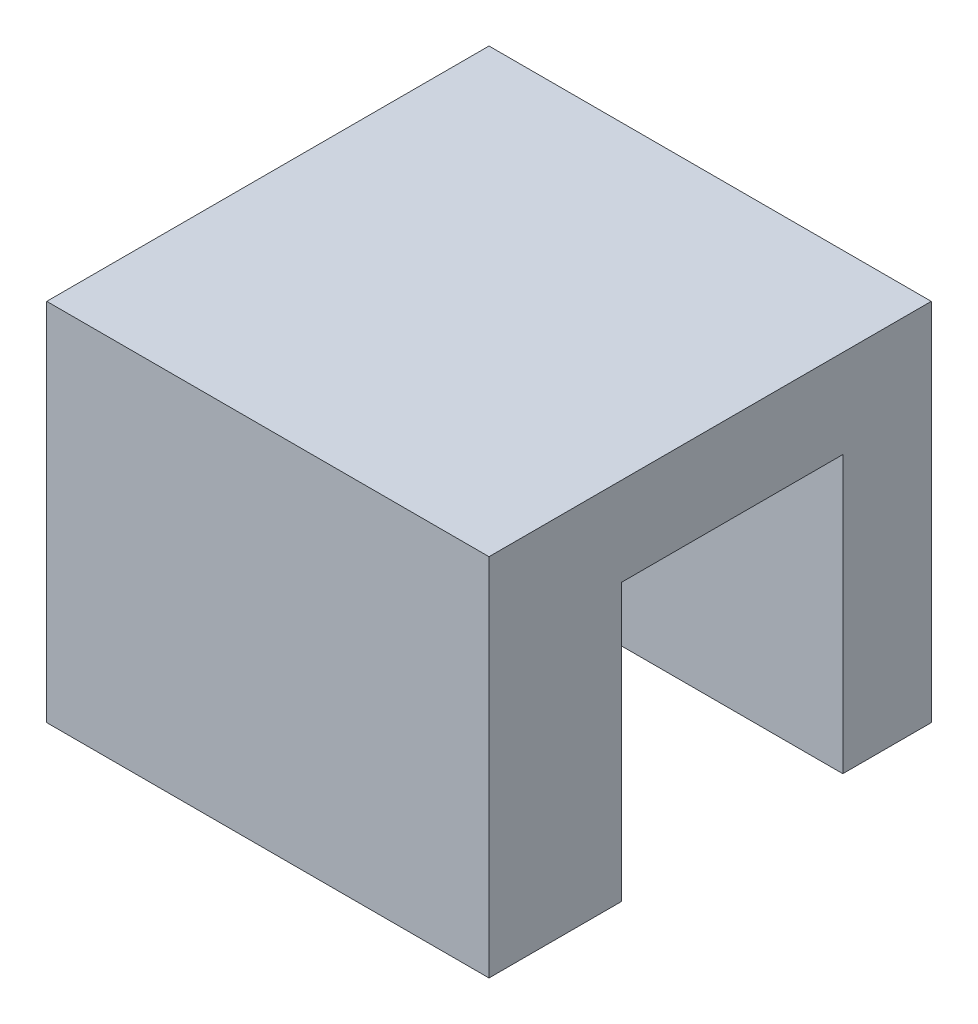
ISO-10303-21;
HEADER;
FILE_DESCRIPTION(('STEP AP214'),'2;1');
FILE_NAME('part.step','',(''),(''),'','','');
FILE_SCHEMA(('AUTOMOTIVE_DESIGN { 1 0 10303 214 1 1 1 1 }'));
ENDSEC;
DATA;
#1=APPLICATION_CONTEXT('core data for automotive mechanical design processes');
#2=APPLICATION_PROTOCOL_DEFINITION('international standard','automotive_design',2000,#1);
#3=PRODUCT_CONTEXT('',#1,'mechanical');
#4=PRODUCT('Part','Part','',(#3));
#5=PRODUCT_RELATED_PRODUCT_CATEGORY('part','',(#4));
#6=PRODUCT_DEFINITION_FORMATION('','',#4);
#7=PRODUCT_DEFINITION_CONTEXT('part definition',#1,'design');
#8=PRODUCT_DEFINITION('design','',#6,#7);
#9=PRODUCT_DEFINITION_SHAPE('','',#8);
#10=(LENGTH_UNIT() NAMED_UNIT(*) SI_UNIT(.MILLI.,.METRE.));
#11=(NAMED_UNIT(*) PLANE_ANGLE_UNIT() SI_UNIT($,.RADIAN.));
#12=(NAMED_UNIT(*) SI_UNIT($,.STERADIAN.) SOLID_ANGLE_UNIT());
#13=UNCERTAINTY_MEASURE_WITH_UNIT(LENGTH_MEASURE(1.E-05),#10,'distance_accuracy_value','');
#14=(GEOMETRIC_REPRESENTATION_CONTEXT(3) GLOBAL_UNCERTAINTY_ASSIGNED_CONTEXT((#13)) GLOBAL_UNIT_ASSIGNED_CONTEXT((#10,
#11,#12)) REPRESENTATION_CONTEXT('',''));
#15=CARTESIAN_POINT('',(0.,0.,0.));
#16=DIRECTION('',(0.,0.,1.));
#17=DIRECTION('',(1.,0.,0.));
#18=AXIS2_PLACEMENT_3D('',#15,#16,#17);
#19=CARTESIAN_POINT('',(-5.56451612903226,12.5,-3.29516129032258));
#20=DIRECTION('',(1.,0.,0.));
#21=DIRECTION('',(0.,0.,-1.));
#22=AXIS2_PLACEMENT_3D('',#19,#20,#21);
#23=PLANE('',#22);
#24=DIRECTION('',(0.,0.,1.));
#25=VECTOR('',#24,1.);
#26=CARTESIAN_POINT('',(-5.56451612903226,0.,-3.29516129032258));
#27=LINE('',#26,#25);
#28=CARTESIAN_POINT('',(-5.56451612903226,0.,-3.29516129032258));
#29=VERTEX_POINT('',#28);
#30=CARTESIAN_POINT('',(-5.56451612903226,0.,2.70483870967742));
#31=VERTEX_POINT('',#30);
#32=EDGE_CURVE('E69',#29,#31,#27,.T.);
#33=ORIENTED_EDGE('',*,*,#32,.T.);
#34=DIRECTION('',(0.,-1.,0.));
#35=VECTOR('',#34,1.);
#36=CARTESIAN_POINT('',(-5.56451612903226,12.5,2.70483870967742));
#37=LINE('',#36,#35);
#38=CARTESIAN_POINT('',(-5.56451612903226,16.5,2.70483870967743));
#39=VERTEX_POINT('',#38);
#40=EDGE_CURVE('E11',#39,#31,#37,.T.);
#41=ORIENTED_EDGE('',*,*,#40,.F.);
#42=DIRECTION('',(0.,0.,1.));
#43=VECTOR('',#42,1.);
#44=CARTESIAN_POINT('',(-5.56451612903226,16.5,2.70483870967743));
#45=LINE('',#44,#43);
#46=CARTESIAN_POINT('',(-5.56451612903227,16.5,-17.2951612903226));
#47=VERTEX_POINT('',#46);
#48=EDGE_CURVE('E96',#47,#39,#45,.T.);
#49=ORIENTED_EDGE('',*,*,#48,.F.);
#50=DIRECTION('',(0.,1.,0.));
#51=VECTOR('',#50,1.);
#52=CARTESIAN_POINT('',(-5.56451612903227,12.5,-17.2951612903226));
#53=LINE('',#52,#51);
#54=CARTESIAN_POINT('',(-5.56451612903227,0.,-17.2951612903226));
#55=VERTEX_POINT('',#54);
#56=EDGE_CURVE('E123',#55,#47,#53,.T.);
#57=ORIENTED_EDGE('',*,*,#56,.F.);
#58=DIRECTION('',(0.,0.,-1.));
#59=VECTOR('',#58,1.);
#60=CARTESIAN_POINT('',(-5.56451612903227,0.,-17.2951612903226));
#61=LINE('',#60,#59);
#62=CARTESIAN_POINT('',(-5.56451612903227,0.,-13.2951612903226));
#63=VERTEX_POINT('',#62);
#64=EDGE_CURVE('E126',#63,#55,#61,.T.);
#65=ORIENTED_EDGE('',*,*,#64,.F.);
#66=DIRECTION('',(0.,-1.,0.));
#67=VECTOR('',#66,1.);
#68=CARTESIAN_POINT('',(-5.56451612903227,12.5,-13.2951612903226));
#69=LINE('',#68,#67);
#70=CARTESIAN_POINT('',(-5.56451612903227,12.5,-13.2951612903226));
#71=VERTEX_POINT('',#70);
#72=EDGE_CURVE('E129',#71,#63,#69,.T.);
#73=ORIENTED_EDGE('',*,*,#72,.F.);
#74=DIRECTION('',(0.,0.,-1.));
#75=VECTOR('',#74,1.);
#76=CARTESIAN_POINT('',(-5.56451612903226,12.5,2.70483870967743));
#77=LINE('',#76,#75);
#78=CARTESIAN_POINT('',(-5.56451612903226,12.5,-3.29516129032258));
#79=VERTEX_POINT('',#78);
#80=EDGE_CURVE('E109',#79,#71,#77,.T.);
#81=ORIENTED_EDGE('',*,*,#80,.F.);
#82=DIRECTION('',(0.,-1.,0.));
#83=VECTOR('',#82,1.);
#84=CARTESIAN_POINT('',(-5.56451612903226,12.5,-3.29516129032258));
#85=LINE('',#84,#83);
#86=EDGE_CURVE('E48',#79,#29,#85,.T.);
#87=ORIENTED_EDGE('',*,*,#86,.T.);
#88=EDGE_LOOP('',(#33,#41,#49,#57,#65,#73,#81,#87));
#89=FACE_BOUND('',#88,.T.);
#90=ADVANCED_FACE('F33',(#89),#23,.F.);
#91=CARTESIAN_POINT('',(-5.56451612903226,12.5,2.70483870967742));
#92=DIRECTION('',(0.,0.,-1.));
#93=DIRECTION('',(-1.,0.,0.));
#94=AXIS2_PLACEMENT_3D('',#91,#92,#93);
#95=PLANE('',#94);
#96=DIRECTION('',(1.,0.,0.));
#97=VECTOR('',#96,1.);
#98=CARTESIAN_POINT('',(-5.56451612903226,0.,2.70483870967742));
#99=LINE('',#98,#97);
#100=CARTESIAN_POINT('',(14.4354838709677,0.,2.70483870967742));
#101=VERTEX_POINT('',#100);
#102=EDGE_CURVE('E82',#31,#101,#99,.T.);
#103=ORIENTED_EDGE('',*,*,#102,.T.);
#104=DIRECTION('',(0.,-1.,0.));
#105=VECTOR('',#104,1.);
#106=CARTESIAN_POINT('',(14.4354838709677,12.5,2.70483870967742));
#107=LINE('',#106,#105);
#108=CARTESIAN_POINT('',(14.4354838709677,16.5,2.70483870967742));
#109=VERTEX_POINT('',#108);
#110=EDGE_CURVE('E41',#109,#101,#107,.T.);
#111=ORIENTED_EDGE('',*,*,#110,.F.);
#112=DIRECTION('',(1.,0.,0.));
#113=VECTOR('',#112,1.);
#114=CARTESIAN_POINT('',(-5.56451612903226,16.5,2.70483870967743));
#115=LINE('',#114,#113);
#116=EDGE_CURVE('E90',#39,#109,#115,.T.);
#117=ORIENTED_EDGE('',*,*,#116,.F.);
#118=ORIENTED_EDGE('',*,*,#40,.T.);
#119=EDGE_LOOP('',(#103,#111,#117,#118));
#120=FACE_BOUND('',#119,.T.);
#121=ADVANCED_FACE('F174',(#120),#95,.F.);
#122=CARTESIAN_POINT('',(14.4354838709677,12.5,-3.29516129032258));
#123=DIRECTION('',(-1.,0.,0.));
#124=DIRECTION('',(0.,0.,1.));
#125=AXIS2_PLACEMENT_3D('',#122,#123,#124);
#126=PLANE('',#125);
#127=DIRECTION('',(0.,0.,-1.));
#128=VECTOR('',#127,1.);
#129=CARTESIAN_POINT('',(14.4354838709677,0.,-3.29516129032258));
#130=LINE('',#129,#128);
#131=CARTESIAN_POINT('',(14.4354838709677,0.,-3.29516129032258));
#132=VERTEX_POINT('',#131);
#133=EDGE_CURVE('E67',#101,#132,#130,.T.);
#134=ORIENTED_EDGE('',*,*,#133,.T.);
#135=DIRECTION('',(0.,-1.,0.));
#136=VECTOR('',#135,1.);
#137=CARTESIAN_POINT('',(14.4354838709677,12.5,-3.29516129032258));
#138=LINE('',#137,#136);
#139=CARTESIAN_POINT('',(14.4354838709677,12.5,-3.29516129032258));
#140=VERTEX_POINT('',#139);
#141=EDGE_CURVE('E78',#140,#132,#138,.T.);
#142=ORIENTED_EDGE('',*,*,#141,.F.);
#143=DIRECTION('',(0.,0.,-1.));
#144=VECTOR('',#143,1.);
#145=CARTESIAN_POINT('',(14.4354838709677,12.5,2.70483870967742));
#146=LINE('',#145,#144);
#147=CARTESIAN_POINT('',(14.4354838709677,12.5,-13.2951612903226));
#148=VERTEX_POINT('',#147);
#149=EDGE_CURVE('E119',#140,#148,#146,.T.);
#150=ORIENTED_EDGE('',*,*,#149,.T.);
#151=DIRECTION('',(0.,-1.,0.));
#152=VECTOR('',#151,1.);
#153=CARTESIAN_POINT('',(14.4354838709677,12.5,-13.2951612903226));
#154=LINE('',#153,#152);
#155=CARTESIAN_POINT('',(14.4354838709677,0.,-13.2951612903226));
#156=VERTEX_POINT('',#155);
#157=EDGE_CURVE('E116',#148,#156,#154,.T.);
#158=ORIENTED_EDGE('',*,*,#157,.T.);
#159=DIRECTION('',(0.,0.,-1.));
#160=VECTOR('',#159,1.);
#161=CARTESIAN_POINT('',(14.4354838709677,0.,-17.2951612903226));
#162=LINE('',#161,#160);
#163=CARTESIAN_POINT('',(14.4354838709677,0.,-17.2951612903226));
#164=VERTEX_POINT('',#163);
#165=EDGE_CURVE('E113',#156,#164,#162,.T.);
#166=ORIENTED_EDGE('',*,*,#165,.T.);
#167=DIRECTION('',(0.,1.,0.));
#168=VECTOR('',#167,1.);
#169=CARTESIAN_POINT('',(14.4354838709677,12.5,-17.2951612903226));
#170=LINE('',#169,#168);
#171=CARTESIAN_POINT('',(14.4354838709677,16.5,-17.2951612903226));
#172=VERTEX_POINT('',#171);
#173=EDGE_CURVE('E110',#164,#172,#170,.T.);
#174=ORIENTED_EDGE('',*,*,#173,.T.);
#175=DIRECTION('',(0.,0.,1.));
#176=VECTOR('',#175,1.);
#177=CARTESIAN_POINT('',(14.4354838709677,16.5,2.70483870967742));
#178=LINE('',#177,#176);
#179=EDGE_CURVE('E107',#172,#109,#178,.T.);
#180=ORIENTED_EDGE('',*,*,#179,.T.);
#181=ORIENTED_EDGE('',*,*,#110,.T.);
#182=EDGE_LOOP('',(#134,#142,#150,#158,#166,#174,#180,#181));
#183=FACE_BOUND('',#182,.T.);
#184=ADVANCED_FACE('F76',(#183),#126,.F.);
#185=CARTESIAN_POINT('',(-5.56451612903226,12.5,-3.29516129032258));
#186=DIRECTION('',(0.,0.,1.));
#187=DIRECTION('',(1.,0.,0.));
#188=AXIS2_PLACEMENT_3D('',#185,#186,#187);
#189=PLANE('',#188);
#190=DIRECTION('',(-1.,0.,0.));
#191=VECTOR('',#190,1.);
#192=CARTESIAN_POINT('',(-5.56451612903226,0.,-3.29516129032258));
#193=LINE('',#192,#191);
#194=EDGE_CURVE('E64',#132,#29,#193,.T.);
#195=ORIENTED_EDGE('',*,*,#194,.T.);
#196=ORIENTED_EDGE('',*,*,#86,.F.);
#197=DIRECTION('',(-1.,0.,0.));
#198=VECTOR('',#197,1.);
#199=CARTESIAN_POINT('',(-2.56451612903226,12.5,-3.29516129032258));
#200=LINE('',#199,#198);
#201=EDGE_CURVE('E71',#140,#79,#200,.T.);
#202=ORIENTED_EDGE('',*,*,#201,.F.);
#203=ORIENTED_EDGE('',*,*,#141,.T.);
#204=EDGE_LOOP('',(#195,#196,#202,#203));
#205=FACE_BOUND('',#204,.T.);
#206=ADVANCED_FACE('F84',(#205),#189,.F.);
#207=CARTESIAN_POINT('',(0.,0.,0.));
#208=DIRECTION('',(0.,1.,0.));
#209=DIRECTION('',(0.,0.,1.));
#210=AXIS2_PLACEMENT_3D('',#207,#208,#209);
#211=PLANE('',#210);
#212=ORIENTED_EDGE('',*,*,#32,.F.);
#213=ORIENTED_EDGE('',*,*,#194,.F.);
#214=ORIENTED_EDGE('',*,*,#133,.F.);
#215=ORIENTED_EDGE('',*,*,#102,.F.);
#216=EDGE_LOOP('',(#212,#213,#214,#215));
#217=FACE_BOUND('',#216,.T.);
#218=ADVANCED_FACE('F66',(#217),#211,.F.);
#219=CARTESIAN_POINT('',(-5.56451612903226,12.5,2.70483870967743));
#220=DIRECTION('',(0.,-1.,0.));
#221=DIRECTION('',(0.,0.,-1.));
#222=AXIS2_PLACEMENT_3D('',#219,#220,#221);
#223=PLANE('',#222);
#224=ORIENTED_EDGE('',*,*,#201,.T.);
#225=ORIENTED_EDGE('',*,*,#80,.T.);
#226=DIRECTION('',(1.,0.,0.));
#227=VECTOR('',#226,1.);
#228=CARTESIAN_POINT('',(-5.56451612903227,12.5,-13.2951612903226));
#229=LINE('',#228,#227);
#230=EDGE_CURVE('E92',#71,#148,#229,.T.);
#231=ORIENTED_EDGE('',*,*,#230,.T.);
#232=ORIENTED_EDGE('',*,*,#149,.F.);
#233=EDGE_LOOP('',(#224,#225,#231,#232));
#234=FACE_BOUND('',#233,.T.);
#235=ADVANCED_FACE('F137',(#234),#223,.T.);
#236=CARTESIAN_POINT('',(-5.56451612903226,16.5,2.70483870967743));
#237=DIRECTION('',(0.,1.,0.));
#238=DIRECTION('',(0.,0.,1.));
#239=AXIS2_PLACEMENT_3D('',#236,#237,#238);
#240=PLANE('',#239);
#241=ORIENTED_EDGE('',*,*,#179,.F.);
#242=DIRECTION('',(1.,0.,0.));
#243=VECTOR('',#242,1.);
#244=CARTESIAN_POINT('',(-5.56451612903227,16.5,-17.2951612903226));
#245=LINE('',#244,#243);
#246=EDGE_CURVE('E102',#47,#172,#245,.T.);
#247=ORIENTED_EDGE('',*,*,#246,.F.);
#248=ORIENTED_EDGE('',*,*,#48,.T.);
#249=ORIENTED_EDGE('',*,*,#116,.T.);
#250=EDGE_LOOP('',(#241,#247,#248,#249));
#251=FACE_BOUND('',#250,.T.);
#252=ADVANCED_FACE('F177',(#251),#240,.T.);
#253=CARTESIAN_POINT('',(-5.56451612903227,12.5,-17.2951612903226));
#254=DIRECTION('',(0.,0.,-1.));
#255=DIRECTION('',(-1.,0.,0.));
#256=AXIS2_PLACEMENT_3D('',#253,#254,#255);
#257=PLANE('',#256);
#258=ORIENTED_EDGE('',*,*,#173,.F.);
#259=DIRECTION('',(1.,0.,0.));
#260=VECTOR('',#259,1.);
#261=CARTESIAN_POINT('',(-5.56451612903227,0.,-17.2951612903226));
#262=LINE('',#261,#260);
#263=EDGE_CURVE('E99',#55,#164,#262,.T.);
#264=ORIENTED_EDGE('',*,*,#263,.F.);
#265=ORIENTED_EDGE('',*,*,#56,.T.);
#266=ORIENTED_EDGE('',*,*,#246,.T.);
#267=EDGE_LOOP('',(#258,#264,#265,#266));
#268=FACE_BOUND('',#267,.T.);
#269=ADVANCED_FACE('F179',(#268),#257,.T.);
#270=CARTESIAN_POINT('',(-5.56451612903227,0.,-17.2951612903226));
#271=DIRECTION('',(0.,-1.,0.));
#272=DIRECTION('',(0.,0.,-1.));
#273=AXIS2_PLACEMENT_3D('',#270,#271,#272);
#274=PLANE('',#273);
#275=ORIENTED_EDGE('',*,*,#165,.F.);
#276=DIRECTION('',(1.,0.,0.));
#277=VECTOR('',#276,1.);
#278=CARTESIAN_POINT('',(-5.56451612903227,0.,-13.2951612903226));
#279=LINE('',#278,#277);
#280=EDGE_CURVE('E95',#63,#156,#279,.T.);
#281=ORIENTED_EDGE('',*,*,#280,.F.);
#282=ORIENTED_EDGE('',*,*,#64,.T.);
#283=ORIENTED_EDGE('',*,*,#263,.T.);
#284=EDGE_LOOP('',(#275,#281,#282,#283));
#285=FACE_BOUND('',#284,.T.);
#286=ADVANCED_FACE('F155',(#285),#274,.T.);
#287=CARTESIAN_POINT('',(-5.56451612903227,12.5,-13.2951612903226));
#288=DIRECTION('',(0.,0.,1.));
#289=DIRECTION('',(1.,0.,0.));
#290=AXIS2_PLACEMENT_3D('',#287,#288,#289);
#291=PLANE('',#290);
#292=ORIENTED_EDGE('',*,*,#157,.F.);
#293=ORIENTED_EDGE('',*,*,#230,.F.);
#294=ORIENTED_EDGE('',*,*,#72,.T.);
#295=ORIENTED_EDGE('',*,*,#280,.T.);
#296=EDGE_LOOP('',(#292,#293,#294,#295));
#297=FACE_BOUND('',#296,.T.);
#298=ADVANCED_FACE('F146',(#297),#291,.T.);
#299=CLOSED_SHELL('',(#90,#121,#184,#206,#218,#235,#252,#269,#286,#298));
#300=MANIFOLD_SOLID_BREP('B2',#299);
#301=ADVANCED_BREP_SHAPE_REPRESENTATION('',(#18,#300),#14);
#302=SHAPE_DEFINITION_REPRESENTATION(#9,#301);
ENDSEC;
END-ISO-10303-21;
